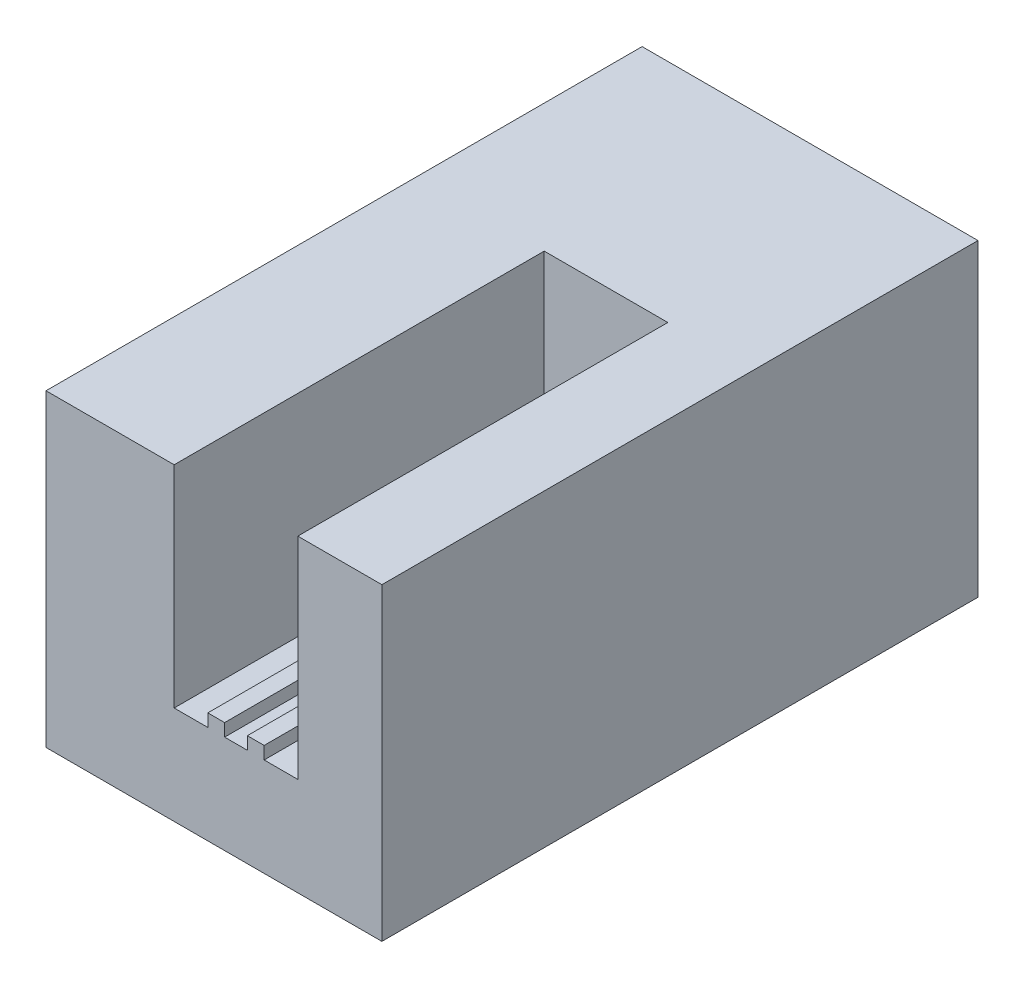
ISO-10303-21;
HEADER;
FILE_DESCRIPTION(('STEP AP214'),'2;1');
FILE_NAME('part.step','',(''),(''),'','','');
FILE_SCHEMA(('AUTOMOTIVE_DESIGN { 1 0 10303 214 1 1 1 1 }'));
ENDSEC;
DATA;
#1=APPLICATION_CONTEXT('core data for automotive mechanical design processes');
#2=APPLICATION_PROTOCOL_DEFINITION('international standard','automotive_design',2000,#1);
#3=PRODUCT_CONTEXT('',#1,'mechanical');
#4=PRODUCT('Part','Part','',(#3));
#5=PRODUCT_RELATED_PRODUCT_CATEGORY('part','',(#4));
#6=PRODUCT_DEFINITION_FORMATION('','',#4);
#7=PRODUCT_DEFINITION_CONTEXT('part definition',#1,'design');
#8=PRODUCT_DEFINITION('design','',#6,#7);
#9=PRODUCT_DEFINITION_SHAPE('','',#8);
#10=(LENGTH_UNIT() NAMED_UNIT(*) SI_UNIT(.MILLI.,.METRE.));
#11=(NAMED_UNIT(*) PLANE_ANGLE_UNIT() SI_UNIT($,.RADIAN.));
#12=(NAMED_UNIT(*) SI_UNIT($,.STERADIAN.) SOLID_ANGLE_UNIT());
#13=UNCERTAINTY_MEASURE_WITH_UNIT(LENGTH_MEASURE(1.E-05),#10,'distance_accuracy_value','');
#14=(GEOMETRIC_REPRESENTATION_CONTEXT(3) GLOBAL_UNCERTAINTY_ASSIGNED_CONTEXT((#13)) GLOBAL_UNIT_ASSIGNED_CONTEXT((#10,
#11,#12)) REPRESENTATION_CONTEXT('',''));
#15=CARTESIAN_POINT('',(0.,0.,0.));
#16=DIRECTION('',(0.,0.,1.));
#17=DIRECTION('',(1.,0.,0.));
#18=AXIS2_PLACEMENT_3D('',#15,#16,#17);
#19=CARTESIAN_POINT('',(0.,0.,0.));
#20=DIRECTION('',(0.,0.,-1.));
#21=DIRECTION('',(-1.,0.,0.));
#22=AXIS2_PLACEMENT_3D('',#19,#20,#21);
#23=PLANE('',#22);
#24=DIRECTION('',(1.,0.,0.));
#25=VECTOR('',#24,1.);
#26=CARTESIAN_POINT('',(-3.60347814561405E-13,1168.5,0.));
#27=LINE('',#26,#25);
#28=CARTESIAN_POINT('',(1524.,1168.5,0.));
#29=VERTEX_POINT('',#28);
#30=CARTESIAN_POINT('',(1924.,1168.5,0.));
#31=VERTEX_POINT('',#30);
#32=EDGE_CURVE('E163',#29,#31,#27,.T.);
#33=ORIENTED_EDGE('',*,*,#32,.F.);
#34=DIRECTION('',(0.,-1.,0.));
#35=VECTOR('',#34,1.);
#36=CARTESIAN_POINT('',(1524.,1318.5,0.));
#37=LINE('',#36,#35);
#38=CARTESIAN_POINT('',(1524.,3673.5,0.));
#39=VERTEX_POINT('',#38);
#40=EDGE_CURVE('E264',#39,#29,#37,.T.);
#41=ORIENTED_EDGE('',*,*,#40,.F.);
#42=DIRECTION('',(-1.,0.,0.));
#43=VECTOR('',#42,1.);
#44=CARTESIAN_POINT('',(0.,3673.5,0.));
#45=LINE('',#44,#43);
#46=CARTESIAN_POINT('',(0.,3673.5,0.));
#47=VERTEX_POINT('',#46);
#48=EDGE_CURVE('E307',#39,#47,#45,.T.);
#49=ORIENTED_EDGE('',*,*,#48,.T.);
#50=DIRECTION('',(0.,-1.,0.));
#51=VECTOR('',#50,1.);
#52=CARTESIAN_POINT('',(0.,0.,0.));
#53=LINE('',#52,#51);
#54=CARTESIAN_POINT('',(0.,0.,0.));
#55=VERTEX_POINT('',#54);
#56=EDGE_CURVE('E274',#47,#55,#53,.T.);
#57=ORIENTED_EDGE('',*,*,#56,.T.);
#58=DIRECTION('',(1.,0.,0.));
#59=VECTOR('',#58,1.);
#60=CARTESIAN_POINT('',(0.,0.,0.));
#61=LINE('',#60,#59);
#62=CARTESIAN_POINT('',(3994.,0.,0.));
#63=VERTEX_POINT('',#62);
#64=EDGE_CURVE('E299',#55,#63,#61,.T.);
#65=ORIENTED_EDGE('',*,*,#64,.T.);
#66=DIRECTION('',(0.,1.,0.));
#67=VECTOR('',#66,1.);
#68=CARTESIAN_POINT('',(3994.,0.,0.));
#69=LINE('',#68,#67);
#70=CARTESIAN_POINT('',(3994.,3673.5,0.));
#71=VERTEX_POINT('',#70);
#72=EDGE_CURVE('E303',#63,#71,#69,.T.);
#73=ORIENTED_EDGE('',*,*,#72,.T.);
#74=CARTESIAN_POINT('',(2994.,3673.5,0.));
#75=VERTEX_POINT('',#74);
#76=EDGE_CURVE('E284',#71,#75,#45,.T.);
#77=ORIENTED_EDGE('',*,*,#76,.T.);
#78=DIRECTION('',(0.,1.,0.));
#79=VECTOR('',#78,1.);
#80=CARTESIAN_POINT('',(2994.,1318.5,0.));
#81=LINE('',#80,#79);
#82=CARTESIAN_POINT('',(2994.,1168.5,0.));
#83=VERTEX_POINT('',#82);
#84=EDGE_CURVE('E182',#83,#75,#81,.T.);
#85=ORIENTED_EDGE('',*,*,#84,.F.);
#86=DIRECTION('',(1.,0.,0.));
#87=VECTOR('',#86,1.);
#88=CARTESIAN_POINT('',(-3.60347814561405E-13,1168.5,0.));
#89=LINE('',#88,#87);
#90=CARTESIAN_POINT('',(2594.,1168.5,0.));
#91=VERTEX_POINT('',#90);
#92=EDGE_CURVE('E224',#91,#83,#89,.T.);
#93=ORIENTED_EDGE('',*,*,#92,.F.);
#94=DIRECTION('',(0.,1.,0.));
#95=VECTOR('',#94,1.);
#96=CARTESIAN_POINT('',(2594.,1168.5,0.));
#97=LINE('',#96,#95);
#98=CARTESIAN_POINT('',(2594.,1318.5,0.));
#99=VERTEX_POINT('',#98);
#100=EDGE_CURVE('E237',#91,#99,#97,.T.);
#101=ORIENTED_EDGE('',*,*,#100,.T.);
#102=DIRECTION('',(1.,0.,0.));
#103=VECTOR('',#102,1.);
#104=CARTESIAN_POINT('',(2994.,1318.5,0.));
#105=LINE('',#104,#103);
#106=CARTESIAN_POINT('',(2394.,1318.5,0.));
#107=VERTEX_POINT('',#106);
#108=EDGE_CURVE('E267',#107,#99,#105,.T.);
#109=ORIENTED_EDGE('',*,*,#108,.F.);
#110=DIRECTION('',(0.,1.,0.));
#111=VECTOR('',#110,1.);
#112=CARTESIAN_POINT('',(2394.,1168.5,0.));
#113=LINE('',#112,#111);
#114=CARTESIAN_POINT('',(2394.,1168.5,0.));
#115=VERTEX_POINT('',#114);
#116=EDGE_CURVE('E203',#115,#107,#113,.T.);
#117=ORIENTED_EDGE('',*,*,#116,.F.);
#118=DIRECTION('',(1.,0.,0.));
#119=VECTOR('',#118,1.);
#120=CARTESIAN_POINT('',(-3.60347814561405E-13,1168.5,0.));
#121=LINE('',#120,#119);
#122=CARTESIAN_POINT('',(2124.,1168.5,0.));
#123=VERTEX_POINT('',#122);
#124=EDGE_CURVE('E187',#123,#115,#121,.T.);
#125=ORIENTED_EDGE('',*,*,#124,.F.);
#126=DIRECTION('',(0.,1.,0.));
#127=VECTOR('',#126,1.);
#128=CARTESIAN_POINT('',(2124.,1168.5,0.));
#129=LINE('',#128,#127);
#130=CARTESIAN_POINT('',(2124.,1318.5,0.));
#131=VERTEX_POINT('',#130);
#132=EDGE_CURVE('E210',#123,#131,#129,.T.);
#133=ORIENTED_EDGE('',*,*,#132,.T.);
#134=CARTESIAN_POINT('',(1924.,1318.5,0.));
#135=VERTEX_POINT('',#134);
#136=EDGE_CURVE('E177',#135,#131,#105,.T.);
#137=ORIENTED_EDGE('',*,*,#136,.F.);
#138=DIRECTION('',(0.,1.,0.));
#139=VECTOR('',#138,1.);
#140=CARTESIAN_POINT('',(1924.,1168.5,0.));
#141=LINE('',#140,#139);
#142=EDGE_CURVE('E156',#31,#135,#141,.T.);
#143=ORIENTED_EDGE('',*,*,#142,.F.);
#144=EDGE_LOOP('',(#33,#41,#49,#57,#65,#73,#77,#85,#93,#101,#109,#117,#125,#133,#137,#143));
#145=FACE_BOUND('',#144,.T.);
#146=ADVANCED_FACE('F38',(#145),#23,.F.);
#147=CARTESIAN_POINT('',(2994.,1318.5,-4400.));
#148=DIRECTION('',(0.,-1.,0.));
#149=DIRECTION('',(1.,0.,0.));
#150=AXIS2_PLACEMENT_3D('',#147,#148,#149);
#151=PLANE('',#150);
#152=DIRECTION('',(1.,0.,0.));
#153=VECTOR('',#152,1.);
#154=CARTESIAN_POINT('',(2994.,1318.5,-4400.));
#155=LINE('',#154,#153);
#156=CARTESIAN_POINT('',(1924.,1318.5,-4400.));
#157=VERTEX_POINT('',#156);
#158=CARTESIAN_POINT('',(2124.,1318.5,-4400.));
#159=VERTEX_POINT('',#158);
#160=EDGE_CURVE('E261',#157,#159,#155,.T.);
#161=ORIENTED_EDGE('',*,*,#160,.F.);
#162=DIRECTION('',(0.,0.,-1.));
#163=VECTOR('',#162,1.);
#164=CARTESIAN_POINT('',(1924.,1318.5,0.));
#165=LINE('',#164,#163);
#166=EDGE_CURVE('E64',#135,#157,#165,.T.);
#167=ORIENTED_EDGE('',*,*,#166,.F.);
#168=ORIENTED_EDGE('',*,*,#136,.T.);
#169=DIRECTION('',(0.,0.,-1.));
#170=VECTOR('',#169,1.);
#171=CARTESIAN_POINT('',(2124.,1318.5,0.));
#172=LINE('',#171,#170);
#173=EDGE_CURVE('E192',#131,#159,#172,.T.);
#174=ORIENTED_EDGE('',*,*,#173,.T.);
#175=EDGE_LOOP('',(#161,#167,#168,#174));
#176=FACE_BOUND('',#175,.T.);
#177=ADVANCED_FACE('F363',(#176),#151,.F.);
#178=CARTESIAN_POINT('',(2394.,1318.5,-4400.));
#179=VERTEX_POINT('',#178);
#180=CARTESIAN_POINT('',(2594.,1318.5,-4400.));
#181=VERTEX_POINT('',#180);
#182=EDGE_CURVE('E257',#179,#181,#155,.T.);
#183=ORIENTED_EDGE('',*,*,#182,.F.);
#184=DIRECTION('',(0.,0.,-1.));
#185=VECTOR('',#184,1.);
#186=CARTESIAN_POINT('',(2394.,1318.5,0.));
#187=LINE('',#186,#185);
#188=EDGE_CURVE('E56',#107,#179,#187,.T.);
#189=ORIENTED_EDGE('',*,*,#188,.F.);
#190=ORIENTED_EDGE('',*,*,#108,.T.);
#191=DIRECTION('',(0.,0.,-1.));
#192=VECTOR('',#191,1.);
#193=CARTESIAN_POINT('',(2594.,1318.5,0.));
#194=LINE('',#193,#192);
#195=EDGE_CURVE('E225',#99,#181,#194,.T.);
#196=ORIENTED_EDGE('',*,*,#195,.T.);
#197=EDGE_LOOP('',(#183,#189,#190,#196));
#198=FACE_BOUND('',#197,.T.);
#199=ADVANCED_FACE('F352',(#198),#151,.F.);
#200=CARTESIAN_POINT('',(0.,0.,-7088.));
#201=DIRECTION('',(-1.,0.,0.));
#202=DIRECTION('',(0.,0.,1.));
#203=AXIS2_PLACEMENT_3D('',#200,#201,#202);
#204=PLANE('',#203);
#205=ORIENTED_EDGE('',*,*,#56,.F.);
#206=DIRECTION('',(0.,0.,1.));
#207=VECTOR('',#206,1.);
#208=CARTESIAN_POINT('',(0.,3673.5,-7088.));
#209=LINE('',#208,#207);
#210=CARTESIAN_POINT('',(0.,3673.5,-7088.));
#211=VERTEX_POINT('',#210);
#212=EDGE_CURVE('E11',#211,#47,#209,.T.);
#213=ORIENTED_EDGE('',*,*,#212,.F.);
#214=DIRECTION('',(0.,-1.,0.));
#215=VECTOR('',#214,1.);
#216=CARTESIAN_POINT('',(0.,0.,-7088.));
#217=LINE('',#216,#215);
#218=CARTESIAN_POINT('',(0.,0.,-7088.));
#219=VERTEX_POINT('',#218);
#220=EDGE_CURVE('E279',#211,#219,#217,.T.);
#221=ORIENTED_EDGE('',*,*,#220,.T.);
#222=DIRECTION('',(0.,0.,1.));
#223=VECTOR('',#222,1.);
#224=CARTESIAN_POINT('',(0.,0.,-7088.));
#225=LINE('',#224,#223);
#226=EDGE_CURVE('E42',#219,#55,#225,.T.);
#227=ORIENTED_EDGE('',*,*,#226,.T.);
#228=EDGE_LOOP('',(#205,#213,#221,#227));
#229=FACE_BOUND('',#228,.T.);
#230=ADVANCED_FACE('F40',(#229),#204,.T.);
#231=CARTESIAN_POINT('',(0.,3673.5,-7088.));
#232=DIRECTION('',(0.,1.,0.));
#233=DIRECTION('',(0.,0.,1.));
#234=AXIS2_PLACEMENT_3D('',#231,#232,#233);
#235=PLANE('',#234);
#236=DIRECTION('',(0.,0.,1.));
#237=VECTOR('',#236,1.);
#238=CARTESIAN_POINT('',(2994.,3673.5,-4400.));
#239=LINE('',#238,#237);
#240=CARTESIAN_POINT('',(2994.,3673.5,-4400.));
#241=VERTEX_POINT('',#240);
#242=EDGE_CURVE('E275',#241,#75,#239,.T.);
#243=ORIENTED_EDGE('',*,*,#242,.T.);
#244=ORIENTED_EDGE('',*,*,#76,.F.);
#245=DIRECTION('',(0.,0.,1.));
#246=VECTOR('',#245,1.);
#247=CARTESIAN_POINT('',(3994.,3673.5,-7088.));
#248=LINE('',#247,#246);
#249=CARTESIAN_POINT('',(3994.,3673.5,-7088.));
#250=VERTEX_POINT('',#249);
#251=EDGE_CURVE('E48',#250,#71,#248,.T.);
#252=ORIENTED_EDGE('',*,*,#251,.F.);
#253=DIRECTION('',(-1.,0.,0.));
#254=VECTOR('',#253,1.);
#255=CARTESIAN_POINT('',(0.,3673.5,-7088.));
#256=LINE('',#255,#254);
#257=EDGE_CURVE('E292',#250,#211,#256,.T.);
#258=ORIENTED_EDGE('',*,*,#257,.T.);
#259=ORIENTED_EDGE('',*,*,#212,.T.);
#260=ORIENTED_EDGE('',*,*,#48,.F.);
#261=DIRECTION('',(0.,0.,1.));
#262=VECTOR('',#261,1.);
#263=CARTESIAN_POINT('',(1524.,3673.5,-4400.));
#264=LINE('',#263,#262);
#265=CARTESIAN_POINT('',(1524.,3673.5,-4400.));
#266=VERTEX_POINT('',#265);
#267=EDGE_CURVE('E271',#266,#39,#264,.T.);
#268=ORIENTED_EDGE('',*,*,#267,.F.);
#269=DIRECTION('',(-1.,0.,0.));
#270=VECTOR('',#269,1.);
#271=CARTESIAN_POINT('',(2994.,3673.5,-4400.));
#272=LINE('',#271,#270);
#273=EDGE_CURVE('E250',#241,#266,#272,.T.);
#274=ORIENTED_EDGE('',*,*,#273,.F.);
#275=EDGE_LOOP('',(#243,#244,#252,#258,#259,#260,#268,#274));
#276=FACE_BOUND('',#275,.T.);
#277=ADVANCED_FACE('F327',(#276),#235,.T.);
#278=CARTESIAN_POINT('',(3994.,0.,-7088.));
#279=DIRECTION('',(1.,0.,0.));
#280=DIRECTION('',(0.,0.,-1.));
#281=AXIS2_PLACEMENT_3D('',#278,#279,#280);
#282=PLANE('',#281);
#283=ORIENTED_EDGE('',*,*,#72,.F.);
#284=DIRECTION('',(0.,0.,1.));
#285=VECTOR('',#284,1.);
#286=CARTESIAN_POINT('',(3994.,0.,-7088.));
#287=LINE('',#286,#285);
#288=CARTESIAN_POINT('',(3994.,0.,-7088.));
#289=VERTEX_POINT('',#288);
#290=EDGE_CURVE('E312',#289,#63,#287,.T.);
#291=ORIENTED_EDGE('',*,*,#290,.F.);
#292=DIRECTION('',(0.,1.,0.));
#293=VECTOR('',#292,1.);
#294=CARTESIAN_POINT('',(3994.,0.,-7088.));
#295=LINE('',#294,#293);
#296=EDGE_CURVE('E288',#289,#250,#295,.T.);
#297=ORIENTED_EDGE('',*,*,#296,.T.);
#298=ORIENTED_EDGE('',*,*,#251,.T.);
#299=EDGE_LOOP('',(#283,#291,#297,#298));
#300=FACE_BOUND('',#299,.T.);
#301=ADVANCED_FACE('F333',(#300),#282,.T.);
#302=CARTESIAN_POINT('',(0.,0.,-7088.));
#303=DIRECTION('',(0.,-1.,0.));
#304=DIRECTION('',(0.,0.,-1.));
#305=AXIS2_PLACEMENT_3D('',#302,#303,#304);
#306=PLANE('',#305);
#307=ORIENTED_EDGE('',*,*,#64,.F.);
#308=ORIENTED_EDGE('',*,*,#226,.F.);
#309=DIRECTION('',(1.,0.,0.));
#310=VECTOR('',#309,1.);
#311=CARTESIAN_POINT('',(0.,0.,-7088.));
#312=LINE('',#311,#310);
#313=EDGE_CURVE('E283',#219,#289,#312,.T.);
#314=ORIENTED_EDGE('',*,*,#313,.T.);
#315=ORIENTED_EDGE('',*,*,#290,.T.);
#316=EDGE_LOOP('',(#307,#308,#314,#315));
#317=FACE_BOUND('',#316,.T.);
#318=ADVANCED_FACE('F322',(#317),#306,.T.);
#319=CARTESIAN_POINT('',(0.,0.,-7088.));
#320=DIRECTION('',(0.,0.,-1.));
#321=DIRECTION('',(-1.,0.,0.));
#322=AXIS2_PLACEMENT_3D('',#319,#320,#321);
#323=PLANE('',#322);
#324=ORIENTED_EDGE('',*,*,#220,.F.);
#325=ORIENTED_EDGE('',*,*,#257,.F.);
#326=ORIENTED_EDGE('',*,*,#296,.F.);
#327=ORIENTED_EDGE('',*,*,#313,.F.);
#328=EDGE_LOOP('',(#324,#325,#326,#327));
#329=FACE_BOUND('',#328,.T.);
#330=ADVANCED_FACE('F330',(#329),#323,.T.);
#331=CARTESIAN_POINT('',(2994.,1318.5,-4400.));
#332=DIRECTION('',(1.,0.,0.));
#333=DIRECTION('',(0.,0.,-1.));
#334=AXIS2_PLACEMENT_3D('',#331,#332,#333);
#335=PLANE('',#334);
#336=ORIENTED_EDGE('',*,*,#84,.T.);
#337=ORIENTED_EDGE('',*,*,#242,.F.);
#338=DIRECTION('',(0.,1.,0.));
#339=VECTOR('',#338,1.);
#340=CARTESIAN_POINT('',(2994.,1318.5,-4400.));
#341=LINE('',#340,#339);
#342=CARTESIAN_POINT('',(2994.,1168.5,-4400.));
#343=VERTEX_POINT('',#342);
#344=EDGE_CURVE('E246',#343,#241,#341,.T.);
#345=ORIENTED_EDGE('',*,*,#344,.F.);
#346=DIRECTION('',(0.,0.,-1.));
#347=VECTOR('',#346,1.);
#348=CARTESIAN_POINT('',(2994.,1168.5,0.));
#349=LINE('',#348,#347);
#350=EDGE_CURVE('E229',#83,#343,#349,.T.);
#351=ORIENTED_EDGE('',*,*,#350,.F.);
#352=EDGE_LOOP('',(#336,#337,#345,#351));
#353=FACE_BOUND('',#352,.T.);
#354=ADVANCED_FACE('F337',(#353),#335,.F.);
#355=CARTESIAN_POINT('',(1524.,1318.5,-4400.));
#356=DIRECTION('',(-1.,0.,0.));
#357=DIRECTION('',(0.,-1.,0.));
#358=AXIS2_PLACEMENT_3D('',#355,#356,#357);
#359=PLANE('',#358);
#360=ORIENTED_EDGE('',*,*,#40,.T.);
#361=DIRECTION('',(0.,0.,1.));
#362=VECTOR('',#361,1.);
#363=CARTESIAN_POINT('',(1524.,1168.5,0.));
#364=LINE('',#363,#362);
#365=CARTESIAN_POINT('',(1524.,1168.5,-4400.));
#366=VERTEX_POINT('',#365);
#367=EDGE_CURVE('E169',#366,#29,#364,.T.);
#368=ORIENTED_EDGE('',*,*,#367,.F.);
#369=DIRECTION('',(0.,-1.,0.));
#370=VECTOR('',#369,1.);
#371=CARTESIAN_POINT('',(1524.,1318.5,-4400.));
#372=LINE('',#371,#370);
#373=EDGE_CURVE('E254',#266,#366,#372,.T.);
#374=ORIENTED_EDGE('',*,*,#373,.F.);
#375=ORIENTED_EDGE('',*,*,#267,.T.);
#376=EDGE_LOOP('',(#360,#368,#374,#375));
#377=FACE_BOUND('',#376,.T.);
#378=ADVANCED_FACE('F371',(#377),#359,.F.);
#379=CARTESIAN_POINT('',(0.,0.,-4400.));
#380=DIRECTION('',(0.,0.,1.));
#381=DIRECTION('',(1.,0.,0.));
#382=AXIS2_PLACEMENT_3D('',#379,#380,#381);
#383=PLANE('',#382);
#384=ORIENTED_EDGE('',*,*,#344,.T.);
#385=ORIENTED_EDGE('',*,*,#273,.T.);
#386=ORIENTED_EDGE('',*,*,#373,.T.);
#387=DIRECTION('',(-1.,0.,0.));
#388=VECTOR('',#387,1.);
#389=CARTESIAN_POINT('',(-3.60347814561405E-13,1168.5,-4400.));
#390=LINE('',#389,#388);
#391=CARTESIAN_POINT('',(1924.,1168.5,-4400.));
#392=VERTEX_POINT('',#391);
#393=EDGE_CURVE('E162',#392,#366,#390,.T.);
#394=ORIENTED_EDGE('',*,*,#393,.F.);
#395=DIRECTION('',(0.,1.,0.));
#396=VECTOR('',#395,1.);
#397=CARTESIAN_POINT('',(1924.,1168.5,-4400.));
#398=LINE('',#397,#396);
#399=EDGE_CURVE('E157',#392,#157,#398,.T.);
#400=ORIENTED_EDGE('',*,*,#399,.T.);
#401=ORIENTED_EDGE('',*,*,#160,.T.);
#402=DIRECTION('',(0.,1.,0.));
#403=VECTOR('',#402,1.);
#404=CARTESIAN_POINT('',(2124.,1168.5,-4400.));
#405=LINE('',#404,#403);
#406=CARTESIAN_POINT('',(2124.,1168.5,-4400.));
#407=VERTEX_POINT('',#406);
#408=EDGE_CURVE('E213',#407,#159,#405,.T.);
#409=ORIENTED_EDGE('',*,*,#408,.F.);
#410=DIRECTION('',(-1.,0.,0.));
#411=VECTOR('',#410,1.);
#412=CARTESIAN_POINT('',(-3.60347814561405E-13,1168.5,-4400.));
#413=LINE('',#412,#411);
#414=CARTESIAN_POINT('',(2394.,1168.5,-4400.));
#415=VERTEX_POINT('',#414);
#416=EDGE_CURVE('E196',#415,#407,#413,.T.);
#417=ORIENTED_EDGE('',*,*,#416,.F.);
#418=DIRECTION('',(0.,1.,0.));
#419=VECTOR('',#418,1.);
#420=CARTESIAN_POINT('',(2394.,1168.5,-4400.));
#421=LINE('',#420,#419);
#422=EDGE_CURVE('E216',#415,#179,#421,.T.);
#423=ORIENTED_EDGE('',*,*,#422,.T.);
#424=ORIENTED_EDGE('',*,*,#182,.T.);
#425=DIRECTION('',(0.,1.,0.));
#426=VECTOR('',#425,1.);
#427=CARTESIAN_POINT('',(2594.,1168.5,-4400.));
#428=LINE('',#427,#426);
#429=CARTESIAN_POINT('',(2594.,1168.5,-4400.));
#430=VERTEX_POINT('',#429);
#431=EDGE_CURVE('E206',#430,#181,#428,.T.);
#432=ORIENTED_EDGE('',*,*,#431,.F.);
#433=DIRECTION('',(-1.,0.,0.));
#434=VECTOR('',#433,1.);
#435=CARTESIAN_POINT('',(-3.60347814561405E-13,1168.5,-4400.));
#436=LINE('',#435,#434);
#437=EDGE_CURVE('E233',#343,#430,#436,.T.);
#438=ORIENTED_EDGE('',*,*,#437,.F.);
#439=EDGE_LOOP('',(#384,#385,#386,#394,#400,#401,#409,#417,#423,#424,#432,#438));
#440=FACE_BOUND('',#439,.T.);
#441=ADVANCED_FACE('F341',(#440),#383,.T.);
#442=CARTESIAN_POINT('',(2594.,1168.5,0.));
#443=DIRECTION('',(1.,0.,0.));
#444=DIRECTION('',(0.,1.,0.));
#445=AXIS2_PLACEMENT_3D('',#442,#443,#444);
#446=PLANE('',#445);
#447=ORIENTED_EDGE('',*,*,#195,.F.);
#448=ORIENTED_EDGE('',*,*,#100,.F.);
#449=DIRECTION('',(0.,0.,-1.));
#450=VECTOR('',#449,1.);
#451=CARTESIAN_POINT('',(2594.,1168.5,0.));
#452=LINE('',#451,#450);
#453=EDGE_CURVE('E221',#91,#430,#452,.T.);
#454=ORIENTED_EDGE('',*,*,#453,.T.);
#455=ORIENTED_EDGE('',*,*,#431,.T.);
#456=EDGE_LOOP('',(#447,#448,#454,#455));
#457=FACE_BOUND('',#456,.T.);
#458=ADVANCED_FACE('F378',(#457),#446,.T.);
#459=CARTESIAN_POINT('',(-3.60347814561405E-13,1168.5,0.));
#460=DIRECTION('',(0.,1.,0.));
#461=DIRECTION('',(-1.,0.,0.));
#462=AXIS2_PLACEMENT_3D('',#459,#460,#461);
#463=PLANE('',#462);
#464=ORIENTED_EDGE('',*,*,#453,.F.);
#465=ORIENTED_EDGE('',*,*,#92,.T.);
#466=ORIENTED_EDGE('',*,*,#350,.T.);
#467=ORIENTED_EDGE('',*,*,#437,.T.);
#468=EDGE_LOOP('',(#464,#465,#466,#467));
#469=FACE_BOUND('',#468,.T.);
#470=ADVANCED_FACE('F345',(#469),#463,.T.);
#471=CARTESIAN_POINT('',(2124.,1168.5,0.));
#472=DIRECTION('',(1.,0.,0.));
#473=DIRECTION('',(0.,1.,0.));
#474=AXIS2_PLACEMENT_3D('',#471,#472,#473);
#475=PLANE('',#474);
#476=ORIENTED_EDGE('',*,*,#173,.F.);
#477=ORIENTED_EDGE('',*,*,#132,.F.);
#478=DIRECTION('',(0.,0.,-1.));
#479=VECTOR('',#478,1.);
#480=CARTESIAN_POINT('',(2124.,1168.5,0.));
#481=LINE('',#480,#479);
#482=EDGE_CURVE('E200',#123,#407,#481,.T.);
#483=ORIENTED_EDGE('',*,*,#482,.T.);
#484=ORIENTED_EDGE('',*,*,#408,.T.);
#485=EDGE_LOOP('',(#476,#477,#483,#484));
#486=FACE_BOUND('',#485,.T.);
#487=ADVANCED_FACE('F451',(#486),#475,.T.);
#488=CARTESIAN_POINT('',(2394.,1168.5,0.));
#489=DIRECTION('',(1.,0.,0.));
#490=DIRECTION('',(0.,1.,0.));
#491=AXIS2_PLACEMENT_3D('',#488,#489,#490);
#492=PLANE('',#491);
#493=ORIENTED_EDGE('',*,*,#188,.T.);
#494=ORIENTED_EDGE('',*,*,#422,.F.);
#495=DIRECTION('',(0.,0.,-1.));
#496=VECTOR('',#495,1.);
#497=CARTESIAN_POINT('',(2394.,1168.5,0.));
#498=LINE('',#497,#496);
#499=EDGE_CURVE('E191',#115,#415,#498,.T.);
#500=ORIENTED_EDGE('',*,*,#499,.F.);
#501=ORIENTED_EDGE('',*,*,#116,.T.);
#502=EDGE_LOOP('',(#493,#494,#500,#501));
#503=FACE_BOUND('',#502,.T.);
#504=ADVANCED_FACE('F355',(#503),#492,.F.);
#505=CARTESIAN_POINT('',(-3.60347814561405E-13,1168.5,0.));
#506=DIRECTION('',(0.,1.,0.));
#507=DIRECTION('',(-1.,0.,0.));
#508=AXIS2_PLACEMENT_3D('',#505,#506,#507);
#509=PLANE('',#508);
#510=ORIENTED_EDGE('',*,*,#124,.T.);
#511=ORIENTED_EDGE('',*,*,#499,.T.);
#512=ORIENTED_EDGE('',*,*,#416,.T.);
#513=ORIENTED_EDGE('',*,*,#482,.F.);
#514=EDGE_LOOP('',(#510,#511,#512,#513));
#515=FACE_BOUND('',#514,.T.);
#516=ADVANCED_FACE('F359',(#515),#509,.T.);
#517=CARTESIAN_POINT('',(1924.,1168.5,0.));
#518=DIRECTION('',(1.,0.,0.));
#519=DIRECTION('',(0.,1.,0.));
#520=AXIS2_PLACEMENT_3D('',#517,#518,#519);
#521=PLANE('',#520);
#522=ORIENTED_EDGE('',*,*,#166,.T.);
#523=ORIENTED_EDGE('',*,*,#399,.F.);
#524=DIRECTION('',(0.,0.,-1.));
#525=VECTOR('',#524,1.);
#526=CARTESIAN_POINT('',(1924.,1168.5,0.));
#527=LINE('',#526,#525);
#528=EDGE_CURVE('E152',#31,#392,#527,.T.);
#529=ORIENTED_EDGE('',*,*,#528,.F.);
#530=ORIENTED_EDGE('',*,*,#142,.T.);
#531=EDGE_LOOP('',(#522,#523,#529,#530));
#532=FACE_BOUND('',#531,.T.);
#533=ADVANCED_FACE('F154',(#532),#521,.F.);
#534=CARTESIAN_POINT('',(-3.60347814561405E-13,1168.5,0.));
#535=DIRECTION('',(0.,1.,0.));
#536=DIRECTION('',(-1.,0.,0.));
#537=AXIS2_PLACEMENT_3D('',#534,#535,#536);
#538=PLANE('',#537);
#539=ORIENTED_EDGE('',*,*,#32,.T.);
#540=ORIENTED_EDGE('',*,*,#528,.T.);
#541=ORIENTED_EDGE('',*,*,#393,.T.);
#542=ORIENTED_EDGE('',*,*,#367,.T.);
#543=EDGE_LOOP('',(#539,#540,#541,#542));
#544=FACE_BOUND('',#543,.T.);
#545=ADVANCED_FACE('F167',(#544),#538,.T.);
#546=CLOSED_SHELL('',(#146,#177,#199,#230,#277,#301,#318,#330,#354,#378,#441,#458,#470,#487,
#504,#516,#533,#545));
#547=MANIFOLD_SOLID_BREP('B2',#546);
#548=ADVANCED_BREP_SHAPE_REPRESENTATION('',(#18,#547),#14);
#549=SHAPE_DEFINITION_REPRESENTATION(#9,#548);
ENDSEC;
END-ISO-10303-21;
